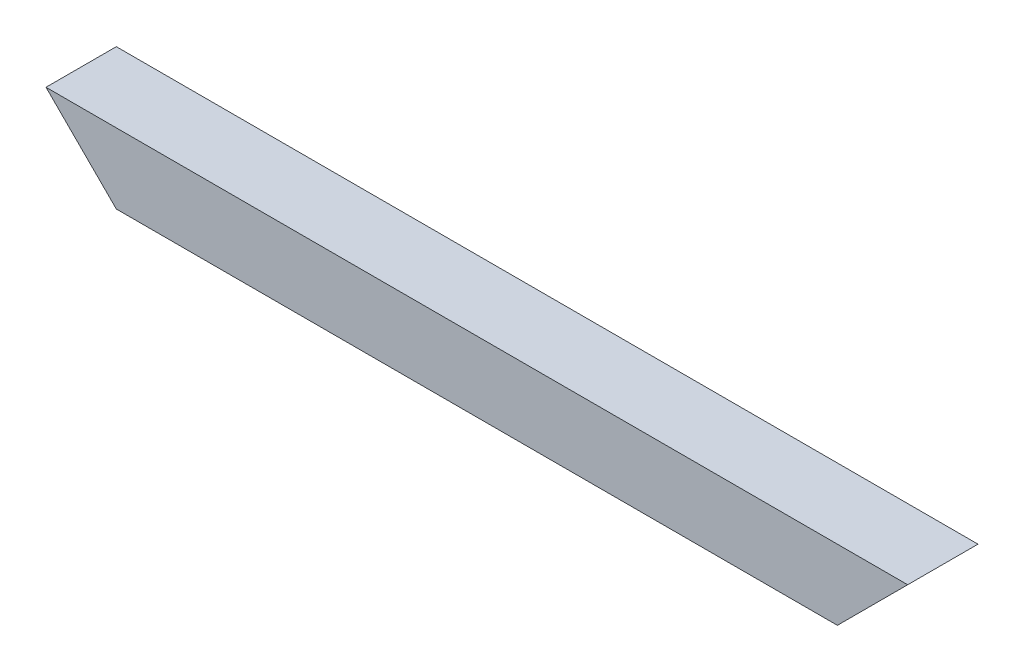
ISO-10303-21;
HEADER;
FILE_DESCRIPTION(('STEP AP214'),'2;1');
FILE_NAME('part.step','',(''),(''),'','','');
FILE_SCHEMA(('AUTOMOTIVE_DESIGN { 1 0 10303 214 1 1 1 1 }'));
ENDSEC;
DATA;
#1=APPLICATION_CONTEXT('core data for automotive mechanical design processes');
#2=APPLICATION_PROTOCOL_DEFINITION('international standard','automotive_design',2000,#1);
#3=PRODUCT_CONTEXT('',#1,'mechanical');
#4=PRODUCT('Part','Part','',(#3));
#5=PRODUCT_RELATED_PRODUCT_CATEGORY('part','',(#4));
#6=PRODUCT_DEFINITION_FORMATION('','',#4);
#7=PRODUCT_DEFINITION_CONTEXT('part definition',#1,'design');
#8=PRODUCT_DEFINITION('design','',#6,#7);
#9=PRODUCT_DEFINITION_SHAPE('','',#8);
#10=(LENGTH_UNIT() NAMED_UNIT(*) SI_UNIT(.MILLI.,.METRE.));
#11=(NAMED_UNIT(*) PLANE_ANGLE_UNIT() SI_UNIT($,.RADIAN.));
#12=(NAMED_UNIT(*) SI_UNIT($,.STERADIAN.) SOLID_ANGLE_UNIT());
#13=UNCERTAINTY_MEASURE_WITH_UNIT(LENGTH_MEASURE(1.E-05),#10,'distance_accuracy_value','');
#14=(GEOMETRIC_REPRESENTATION_CONTEXT(3) GLOBAL_UNCERTAINTY_ASSIGNED_CONTEXT((#13)) GLOBAL_UNIT_ASSIGNED_CONTEXT((#10,
#11,#12)) REPRESENTATION_CONTEXT('',''));
#15=CARTESIAN_POINT('',(0.,0.,0.));
#16=DIRECTION('',(0.,0.,1.));
#17=DIRECTION('',(1.,0.,0.));
#18=AXIS2_PLACEMENT_3D('',#15,#16,#17);
#19=CARTESIAN_POINT('',(466.9733182994,-38.1,0.));
#20=DIRECTION('',(0.,1.,0.));
#21=DIRECTION('',(0.,0.,1.));
#22=AXIS2_PLACEMENT_3D('',#19,#20,#21);
#23=PLANE('',#22);
#24=DIRECTION('',(0.,0.,-1.));
#25=VECTOR('',#24,1.);
#26=CARTESIAN_POINT('',(428.8733182994,-38.1,587.589487870189));
#27=LINE('',#26,#25);
#28=CARTESIAN_POINT('',(428.8733182994,-38.1,0.));
#29=VERTEX_POINT('',#28);
#30=CARTESIAN_POINT('',(428.8733182994,-38.1,-38.1));
#31=VERTEX_POINT('',#30);
#32=EDGE_CURVE('E59',#29,#31,#27,.T.);
#33=ORIENTED_EDGE('',*,*,#32,.F.);
#34=DIRECTION('',(-1.,0.,0.));
#35=VECTOR('',#34,1.);
#36=CARTESIAN_POINT('',(466.9733182994,-38.1,0.));
#37=LINE('',#36,#35);
#38=CARTESIAN_POINT('',(38.1000000000001,-38.1,0.));
#39=VERTEX_POINT('',#38);
#40=EDGE_CURVE('E65',#29,#39,#37,.T.);
#41=ORIENTED_EDGE('',*,*,#40,.T.);
#42=DIRECTION('',(0.,0.,-1.));
#43=VECTOR('',#42,1.);
#44=CARTESIAN_POINT('',(38.1,-38.1,587.589487870189));
#45=LINE('',#44,#43);
#46=CARTESIAN_POINT('',(38.1,-38.1,-38.1));
#47=VERTEX_POINT('',#46);
#48=EDGE_CURVE('E99',#39,#47,#45,.T.);
#49=ORIENTED_EDGE('',*,*,#48,.T.);
#50=DIRECTION('',(-1.,0.,0.));
#51=VECTOR('',#50,1.);
#52=CARTESIAN_POINT('',(466.9733182994,-38.1,-38.1));
#53=LINE('',#52,#51);
#54=EDGE_CURVE('E107',#31,#47,#53,.T.);
#55=ORIENTED_EDGE('',*,*,#54,.F.);
#56=EDGE_LOOP('',(#33,#41,#49,#55));
#57=FACE_BOUND('',#56,.T.);
#58=ADVANCED_FACE('F43',(#57),#23,.F.);
#59=CARTESIAN_POINT('',(466.9733182994,0.,0.));
#60=DIRECTION('',(0.,0.,-1.));
#61=DIRECTION('',(0.,1.,0.));
#62=AXIS2_PLACEMENT_3D('',#59,#60,#61);
#63=PLANE('',#62);
#64=ORIENTED_EDGE('',*,*,#40,.F.);
#65=DIRECTION('',(0.707106781186548,0.707106781186547,0.));
#66=VECTOR('',#65,1.);
#67=CARTESIAN_POINT('',(466.9733182994,0.,0.));
#68=LINE('',#67,#66);
#69=CARTESIAN_POINT('',(466.9733182994,0.,0.));
#70=VERTEX_POINT('',#69);
#71=EDGE_CURVE('E86',#29,#70,#68,.T.);
#72=ORIENTED_EDGE('',*,*,#71,.T.);
#73=DIRECTION('',(-1.,0.,0.));
#74=VECTOR('',#73,1.);
#75=CARTESIAN_POINT('',(466.9733182994,0.,0.));
#76=LINE('',#75,#74);
#77=CARTESIAN_POINT('',(0.,0.,0.));
#78=VERTEX_POINT('',#77);
#79=EDGE_CURVE('E92',#70,#78,#76,.T.);
#80=ORIENTED_EDGE('',*,*,#79,.T.);
#81=DIRECTION('',(-0.707106781186548,0.707106781186548,0.));
#82=VECTOR('',#81,1.);
#83=CARTESIAN_POINT('',(233.4866591497,-233.4866591497,0.));
#84=LINE('',#83,#82);
#85=EDGE_CURVE('E123',#39,#78,#84,.T.);
#86=ORIENTED_EDGE('',*,*,#85,.F.);
#87=EDGE_LOOP('',(#64,#72,#80,#86));
#88=FACE_BOUND('',#87,.T.);
#89=ADVANCED_FACE('F45',(#88),#63,.F.);
#90=CARTESIAN_POINT('',(466.9733182994,0.,-38.1));
#91=DIRECTION('',(0.,0.,1.));
#92=DIRECTION('',(1.,0.,0.));
#93=AXIS2_PLACEMENT_3D('',#90,#91,#92);
#94=PLANE('',#93);
#95=DIRECTION('',(-1.,0.,0.));
#96=VECTOR('',#95,1.);
#97=CARTESIAN_POINT('',(466.9733182994,0.,-38.1));
#98=LINE('',#97,#96);
#99=CARTESIAN_POINT('',(466.9733182994,0.,-38.1));
#100=VERTEX_POINT('',#99);
#101=CARTESIAN_POINT('',(0.,0.,-38.1));
#102=VERTEX_POINT('',#101);
#103=EDGE_CURVE('E104',#100,#102,#98,.T.);
#104=ORIENTED_EDGE('',*,*,#103,.F.);
#105=DIRECTION('',(-0.707106781186548,-0.707106781186547,0.));
#106=VECTOR('',#105,1.);
#107=CARTESIAN_POINT('',(466.9733182994,0.,-38.1));
#108=LINE('',#107,#106);
#109=EDGE_CURVE('E11',#100,#31,#108,.T.);
#110=ORIENTED_EDGE('',*,*,#109,.T.);
#111=ORIENTED_EDGE('',*,*,#54,.T.);
#112=DIRECTION('',(0.707106781186548,-0.707106781186548,0.));
#113=VECTOR('',#112,1.);
#114=CARTESIAN_POINT('',(233.4866591497,-233.4866591497,-38.1));
#115=LINE('',#114,#113);
#116=EDGE_CURVE('E52',#102,#47,#115,.T.);
#117=ORIENTED_EDGE('',*,*,#116,.F.);
#118=EDGE_LOOP('',(#104,#110,#111,#117));
#119=FACE_BOUND('',#118,.T.);
#120=ADVANCED_FACE('F120',(#119),#94,.F.);
#121=CARTESIAN_POINT('',(466.9733182994,0.,0.));
#122=DIRECTION('',(0.,-1.,0.));
#123=DIRECTION('',(0.,0.,-1.));
#124=AXIS2_PLACEMENT_3D('',#121,#122,#123);
#125=PLANE('',#124);
#126=DIRECTION('',(0.,0.,1.));
#127=VECTOR('',#126,1.);
#128=CARTESIAN_POINT('',(0.,0.,0.));
#129=LINE('',#128,#127);
#130=EDGE_CURVE('E93',#102,#78,#129,.T.);
#131=ORIENTED_EDGE('',*,*,#130,.T.);
#132=ORIENTED_EDGE('',*,*,#79,.F.);
#133=DIRECTION('',(0.,0.,1.));
#134=VECTOR('',#133,1.);
#135=CARTESIAN_POINT('',(466.9733182994,0.,0.));
#136=LINE('',#135,#134);
#137=EDGE_CURVE('E83',#100,#70,#136,.T.);
#138=ORIENTED_EDGE('',*,*,#137,.F.);
#139=ORIENTED_EDGE('',*,*,#103,.T.);
#140=EDGE_LOOP('',(#131,#132,#138,#139));
#141=FACE_BOUND('',#140,.T.);
#142=ADVANCED_FACE('F101',(#141),#125,.F.);
#143=CARTESIAN_POINT('',(38.1,-38.1,587.589487870189));
#144=DIRECTION('',(-0.707106781186548,-0.707106781186548,0.));
#145=DIRECTION('',(0.707106781186548,-0.707106781186548,0.));
#146=AXIS2_PLACEMENT_3D('',#143,#144,#145);
#147=PLANE('',#146);
#148=ORIENTED_EDGE('',*,*,#48,.F.);
#149=ORIENTED_EDGE('',*,*,#85,.T.);
#150=ORIENTED_EDGE('',*,*,#130,.F.);
#151=ORIENTED_EDGE('',*,*,#116,.T.);
#152=EDGE_LOOP('',(#148,#149,#150,#151));
#153=FACE_BOUND('',#152,.T.);
#154=ADVANCED_FACE('F118',(#153),#147,.T.);
#155=CARTESIAN_POINT('',(428.8733182994,-38.1,587.589487870189));
#156=DIRECTION('',(-0.707106781186547,0.707106781186548,0.));
#157=DIRECTION('',(-0.707106781186548,-0.707106781186547,0.));
#158=AXIS2_PLACEMENT_3D('',#155,#156,#157);
#159=PLANE('',#158);
#160=ORIENTED_EDGE('',*,*,#71,.F.);
#161=ORIENTED_EDGE('',*,*,#32,.T.);
#162=ORIENTED_EDGE('',*,*,#109,.F.);
#163=ORIENTED_EDGE('',*,*,#137,.T.);
#164=EDGE_LOOP('',(#160,#161,#162,#163));
#165=FACE_BOUND('',#164,.T.);
#166=ADVANCED_FACE('F85',(#165),#159,.F.);
#167=CLOSED_SHELL('',(#58,#89,#120,#142,#154,#166));
#168=MANIFOLD_SOLID_BREP('B2',#167);
#169=ADVANCED_BREP_SHAPE_REPRESENTATION('',(#18,#168),#14);
#170=SHAPE_DEFINITION_REPRESENTATION(#9,#169);
ENDSEC;
END-ISO-10303-21;
